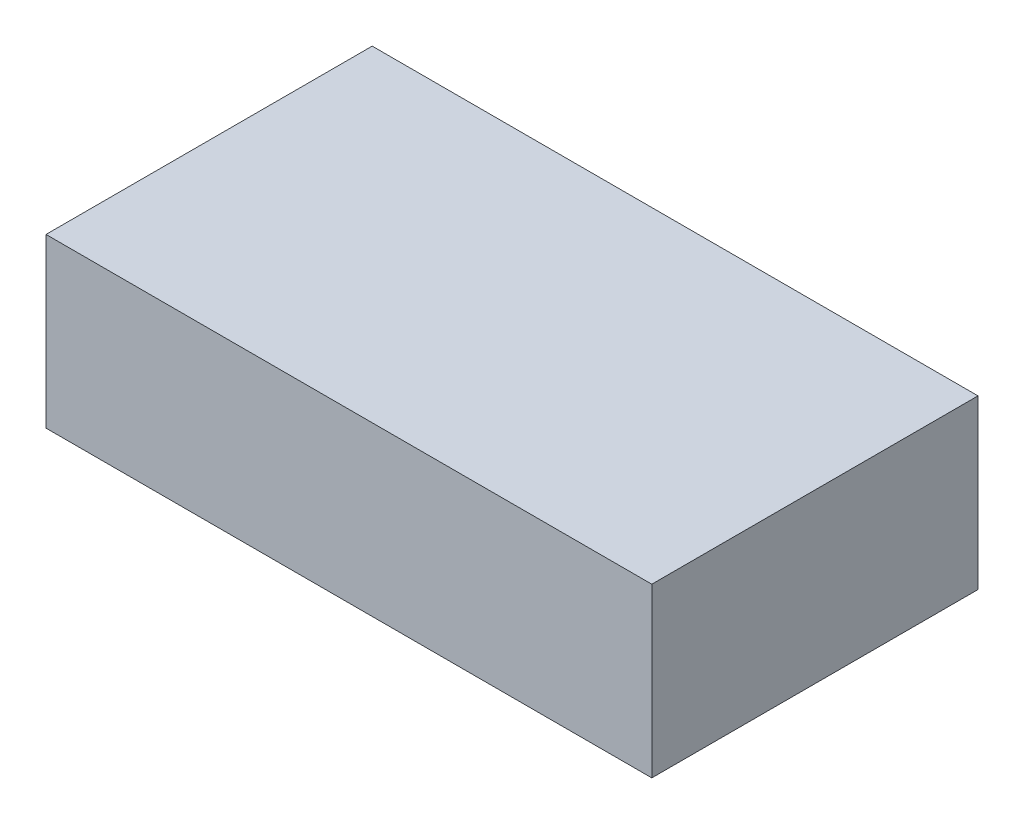
ISO-10303-21;
HEADER;
FILE_DESCRIPTION(('STEP AP214'),'2;1');
FILE_NAME('part.step','',(''),(''),'','','');
FILE_SCHEMA(('AUTOMOTIVE_DESIGN { 1 0 10303 214 1 1 1 1 }'));
ENDSEC;
DATA;
#1=APPLICATION_CONTEXT('core data for automotive mechanical design processes');
#2=APPLICATION_PROTOCOL_DEFINITION('international standard','automotive_design',2000,#1);
#3=PRODUCT_CONTEXT('',#1,'mechanical');
#4=PRODUCT('Part','Part','',(#3));
#5=PRODUCT_RELATED_PRODUCT_CATEGORY('part','',(#4));
#6=PRODUCT_DEFINITION_FORMATION('','',#4);
#7=PRODUCT_DEFINITION_CONTEXT('part definition',#1,'design');
#8=PRODUCT_DEFINITION('design','',#6,#7);
#9=PRODUCT_DEFINITION_SHAPE('','',#8);
#10=(LENGTH_UNIT() NAMED_UNIT(*) SI_UNIT(.MILLI.,.METRE.));
#11=(NAMED_UNIT(*) PLANE_ANGLE_UNIT() SI_UNIT($,.RADIAN.));
#12=(NAMED_UNIT(*) SI_UNIT($,.STERADIAN.) SOLID_ANGLE_UNIT());
#13=UNCERTAINTY_MEASURE_WITH_UNIT(LENGTH_MEASURE(1.E-05),#10,'distance_accuracy_value','');
#14=(GEOMETRIC_REPRESENTATION_CONTEXT(3) GLOBAL_UNCERTAINTY_ASSIGNED_CONTEXT((#13)) GLOBAL_UNIT_ASSIGNED_CONTEXT((#10,
#11,#12)) REPRESENTATION_CONTEXT('',''));
#15=CARTESIAN_POINT('',(0.,0.,0.));
#16=DIRECTION('',(0.,0.,1.));
#17=DIRECTION('',(1.,0.,0.));
#18=AXIS2_PLACEMENT_3D('',#15,#16,#17);
#19=CARTESIAN_POINT('',(32.5,18.,-17.5));
#20=DIRECTION('',(-1.,0.,0.));
#21=DIRECTION('',(0.,0.,1.));
#22=AXIS2_PLACEMENT_3D('',#19,#20,#21);
#23=PLANE('',#22);
#24=DIRECTION('',(0.,0.,-1.));
#25=VECTOR('',#24,1.);
#26=CARTESIAN_POINT('',(32.5,0.,-17.5));
#27=LINE('',#26,#25);
#28=CARTESIAN_POINT('',(32.5,0.,17.5));
#29=VERTEX_POINT('',#28);
#30=CARTESIAN_POINT('',(32.5,0.,-17.5));
#31=VERTEX_POINT('',#30);
#32=EDGE_CURVE('E100',#29,#31,#27,.T.);
#33=ORIENTED_EDGE('',*,*,#32,.T.);
#34=DIRECTION('',(0.,-1.,0.));
#35=VECTOR('',#34,1.);
#36=CARTESIAN_POINT('',(32.5,18.,-17.5));
#37=LINE('',#36,#35);
#38=CARTESIAN_POINT('',(32.5,18.,-17.5));
#39=VERTEX_POINT('',#38);
#40=EDGE_CURVE('E11',#39,#31,#37,.T.);
#41=ORIENTED_EDGE('',*,*,#40,.F.);
#42=DIRECTION('',(0.,0.,-1.));
#43=VECTOR('',#42,1.);
#44=CARTESIAN_POINT('',(32.5,18.,-17.5));
#45=LINE('',#44,#43);
#46=CARTESIAN_POINT('',(32.5,18.,17.5));
#47=VERTEX_POINT('',#46);
#48=EDGE_CURVE('E88',#47,#39,#45,.T.);
#49=ORIENTED_EDGE('',*,*,#48,.F.);
#50=DIRECTION('',(0.,-1.,0.));
#51=VECTOR('',#50,1.);
#52=CARTESIAN_POINT('',(32.5,18.,17.5));
#53=LINE('',#52,#51);
#54=EDGE_CURVE('E96',#47,#29,#53,.T.);
#55=ORIENTED_EDGE('',*,*,#54,.T.);
#56=EDGE_LOOP('',(#33,#41,#49,#55));
#57=FACE_BOUND('',#56,.T.);
#58=ADVANCED_FACE('F37',(#57),#23,.F.);
#59=CARTESIAN_POINT('',(-32.5,18.,-17.5));
#60=DIRECTION('',(0.,0.,1.));
#61=DIRECTION('',(1.,0.,0.));
#62=AXIS2_PLACEMENT_3D('',#59,#60,#61);
#63=PLANE('',#62);
#64=DIRECTION('',(-1.,0.,0.));
#65=VECTOR('',#64,1.);
#66=CARTESIAN_POINT('',(-32.5,0.,-17.5));
#67=LINE('',#66,#65);
#68=CARTESIAN_POINT('',(-32.5,0.,-17.5));
#69=VERTEX_POINT('',#68);
#70=EDGE_CURVE('E92',#31,#69,#67,.T.);
#71=ORIENTED_EDGE('',*,*,#70,.T.);
#72=DIRECTION('',(0.,-1.,0.));
#73=VECTOR('',#72,1.);
#74=CARTESIAN_POINT('',(-32.5,18.,-17.5));
#75=LINE('',#74,#73);
#76=CARTESIAN_POINT('',(-32.5,18.,-17.5));
#77=VERTEX_POINT('',#76);
#78=EDGE_CURVE('E45',#77,#69,#75,.T.);
#79=ORIENTED_EDGE('',*,*,#78,.F.);
#80=DIRECTION('',(-1.,0.,0.));
#81=VECTOR('',#80,1.);
#82=CARTESIAN_POINT('',(-32.5,18.,-17.5));
#83=LINE('',#82,#81);
#84=EDGE_CURVE('E83',#39,#77,#83,.T.);
#85=ORIENTED_EDGE('',*,*,#84,.F.);
#86=ORIENTED_EDGE('',*,*,#40,.T.);
#87=EDGE_LOOP('',(#71,#79,#85,#86));
#88=FACE_BOUND('',#87,.T.);
#89=ADVANCED_FACE('F91',(#88),#63,.F.);
#90=CARTESIAN_POINT('',(-32.5,18.,-17.5));
#91=DIRECTION('',(1.,0.,0.));
#92=DIRECTION('',(0.,0.,-1.));
#93=AXIS2_PLACEMENT_3D('',#90,#91,#92);
#94=PLANE('',#93);
#95=DIRECTION('',(0.,0.,1.));
#96=VECTOR('',#95,1.);
#97=CARTESIAN_POINT('',(-32.5,0.,-17.5));
#98=LINE('',#97,#96);
#99=CARTESIAN_POINT('',(-32.5,0.,17.5));
#100=VERTEX_POINT('',#99);
#101=EDGE_CURVE('E70',#69,#100,#98,.T.);
#102=ORIENTED_EDGE('',*,*,#101,.T.);
#103=DIRECTION('',(0.,-1.,0.));
#104=VECTOR('',#103,1.);
#105=CARTESIAN_POINT('',(-32.5,18.,17.5));
#106=LINE('',#105,#104);
#107=CARTESIAN_POINT('',(-32.5,18.,17.5));
#108=VERTEX_POINT('',#107);
#109=EDGE_CURVE('E93',#108,#100,#106,.T.);
#110=ORIENTED_EDGE('',*,*,#109,.F.);
#111=DIRECTION('',(0.,0.,1.));
#112=VECTOR('',#111,1.);
#113=CARTESIAN_POINT('',(-32.5,18.,-17.5));
#114=LINE('',#113,#112);
#115=EDGE_CURVE('E86',#77,#108,#114,.T.);
#116=ORIENTED_EDGE('',*,*,#115,.F.);
#117=ORIENTED_EDGE('',*,*,#78,.T.);
#118=EDGE_LOOP('',(#102,#110,#116,#117));
#119=FACE_BOUND('',#118,.T.);
#120=ADVANCED_FACE('F94',(#119),#94,.F.);
#121=CARTESIAN_POINT('',(-32.5,18.,17.5));
#122=DIRECTION('',(0.,0.,-1.));
#123=DIRECTION('',(-1.,0.,0.));
#124=AXIS2_PLACEMENT_3D('',#121,#122,#123);
#125=PLANE('',#124);
#126=DIRECTION('',(1.,0.,0.));
#127=VECTOR('',#126,1.);
#128=CARTESIAN_POINT('',(-32.5,0.,17.5));
#129=LINE('',#128,#127);
#130=EDGE_CURVE('E76',#100,#29,#129,.T.);
#131=ORIENTED_EDGE('',*,*,#130,.T.);
#132=ORIENTED_EDGE('',*,*,#54,.F.);
#133=DIRECTION('',(1.,0.,0.));
#134=VECTOR('',#133,1.);
#135=CARTESIAN_POINT('',(-32.5,18.,17.5));
#136=LINE('',#135,#134);
#137=EDGE_CURVE('E53',#108,#47,#136,.T.);
#138=ORIENTED_EDGE('',*,*,#137,.F.);
#139=ORIENTED_EDGE('',*,*,#109,.T.);
#140=EDGE_LOOP('',(#131,#132,#138,#139));
#141=FACE_BOUND('',#140,.T.);
#142=ADVANCED_FACE('F107',(#141),#125,.F.);
#143=CARTESIAN_POINT('',(0.,18.,0.));
#144=DIRECTION('',(0.,1.,0.));
#145=DIRECTION('',(0.,0.,1.));
#146=AXIS2_PLACEMENT_3D('',#143,#144,#145);
#147=PLANE('',#146);
#148=ORIENTED_EDGE('',*,*,#48,.T.);
#149=ORIENTED_EDGE('',*,*,#84,.T.);
#150=ORIENTED_EDGE('',*,*,#115,.T.);
#151=ORIENTED_EDGE('',*,*,#137,.T.);
#152=EDGE_LOOP('',(#148,#149,#150,#151));
#153=FACE_BOUND('',#152,.T.);
#154=ADVANCED_FACE('F84',(#153),#147,.T.);
#155=CARTESIAN_POINT('',(0.,0.,0.));
#156=DIRECTION('',(0.,1.,0.));
#157=DIRECTION('',(0.,0.,1.));
#158=AXIS2_PLACEMENT_3D('',#155,#156,#157);
#159=PLANE('',#158);
#160=ORIENTED_EDGE('',*,*,#32,.F.);
#161=ORIENTED_EDGE('',*,*,#130,.F.);
#162=ORIENTED_EDGE('',*,*,#101,.F.);
#163=ORIENTED_EDGE('',*,*,#70,.F.);
#164=EDGE_LOOP('',(#160,#161,#162,#163));
#165=FACE_BOUND('',#164,.T.);
#166=ADVANCED_FACE('F110',(#165),#159,.F.);
#167=CLOSED_SHELL('',(#58,#89,#120,#142,#154,#166));
#168=MANIFOLD_SOLID_BREP('B2',#167);
#169=ADVANCED_BREP_SHAPE_REPRESENTATION('',(#18,#168),#14);
#170=SHAPE_DEFINITION_REPRESENTATION(#9,#169);
ENDSEC;
END-ISO-10303-21;
